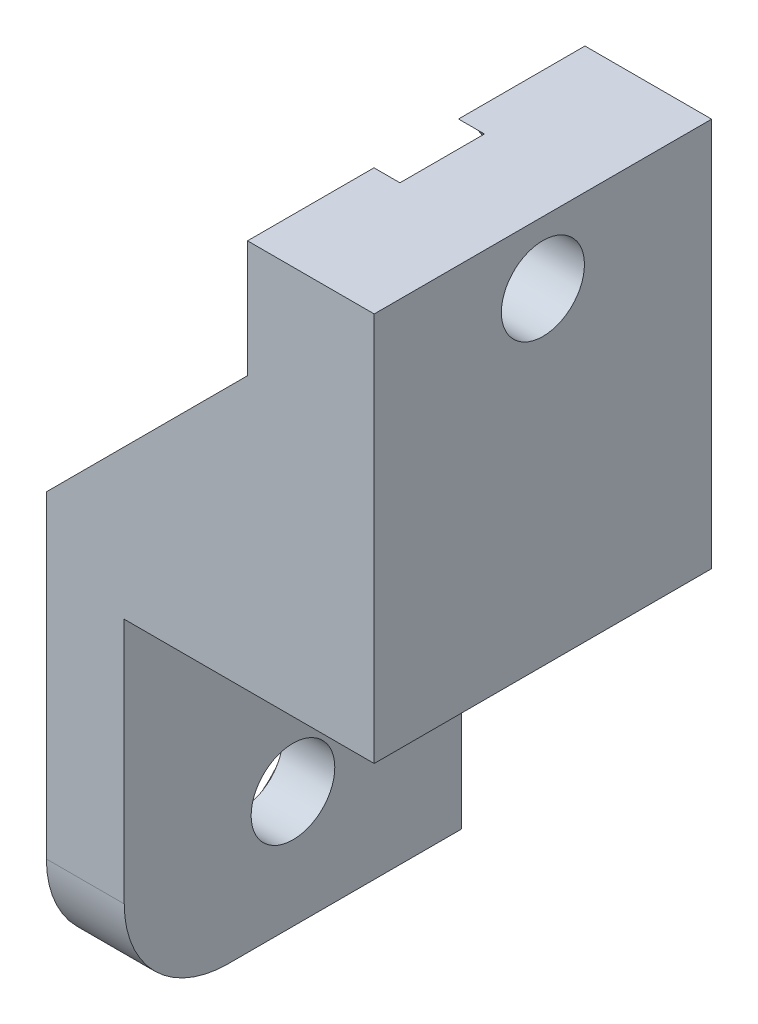
ISO-10303-21;
HEADER;
FILE_DESCRIPTION(('STEP AP214'),'2;1');
FILE_NAME('part.step','',(''),(''),'','','');
FILE_SCHEMA(('AUTOMOTIVE_DESIGN { 1 0 10303 214 1 1 1 1 }'));
ENDSEC;
DATA;
#1=APPLICATION_CONTEXT('core data for automotive mechanical design processes');
#2=APPLICATION_PROTOCOL_DEFINITION('international standard','automotive_design',2000,#1);
#3=PRODUCT_CONTEXT('',#1,'mechanical');
#4=PRODUCT('Part','Part','',(#3));
#5=PRODUCT_RELATED_PRODUCT_CATEGORY('part','',(#4));
#6=PRODUCT_DEFINITION_FORMATION('','',#4);
#7=PRODUCT_DEFINITION_CONTEXT('part definition',#1,'design');
#8=PRODUCT_DEFINITION('design','',#6,#7);
#9=PRODUCT_DEFINITION_SHAPE('','',#8);
#10=(LENGTH_UNIT() NAMED_UNIT(*) SI_UNIT(.MILLI.,.METRE.));
#11=(NAMED_UNIT(*) PLANE_ANGLE_UNIT() SI_UNIT($,.RADIAN.));
#12=(NAMED_UNIT(*) SI_UNIT($,.STERADIAN.) SOLID_ANGLE_UNIT());
#13=UNCERTAINTY_MEASURE_WITH_UNIT(LENGTH_MEASURE(1.E-05),#10,'distance_accuracy_value','');
#14=(GEOMETRIC_REPRESENTATION_CONTEXT(3) GLOBAL_UNCERTAINTY_ASSIGNED_CONTEXT((#13)) GLOBAL_UNIT_ASSIGNED_CONTEXT((#10,
#11,#12)) REPRESENTATION_CONTEXT('',''));
#15=CARTESIAN_POINT('',(0.,0.,0.));
#16=DIRECTION('',(0.,0.,1.));
#17=DIRECTION('',(1.,0.,0.));
#18=AXIS2_PLACEMENT_3D('',#15,#16,#17);
#19=CARTESIAN_POINT('',(30.3343708985291,78.2634604627299,85.1716360974316));
#20=DIRECTION('',(-1.,0.,0.));
#21=DIRECTION('',(0.,0.,1.));
#22=AXIS2_PLACEMENT_3D('',#19,#20,#21);
#23=PLANE('',#22);
#24=DIRECTION('',(0.,-1.,0.));
#25=VECTOR('',#24,1.);
#26=CARTESIAN_POINT('',(30.3343708985291,78.2634604627299,85.1716360974316));
#27=LINE('',#26,#25);
#28=CARTESIAN_POINT('',(30.3343708985291,78.2634604627299,85.1716360974316));
#29=VERTEX_POINT('',#28);
#30=CARTESIAN_POINT('',(30.3343708985291,73.76346046273,85.1716360974316));
#31=VERTEX_POINT('',#30);
#32=EDGE_CURVE('E258',#29,#31,#27,.T.);
#33=ORIENTED_EDGE('',*,*,#32,.T.);
#34=DIRECTION('',(0.,0.,1.));
#35=VECTOR('',#34,1.);
#36=CARTESIAN_POINT('',(30.3343708985291,73.76346046273,98.1716360974316));
#37=LINE('',#36,#35);
#38=CARTESIAN_POINT('',(30.3343708985291,73.76346046273,89.6716360974314));
#39=VERTEX_POINT('',#38);
#40=EDGE_CURVE('E211',#31,#39,#37,.T.);
#41=ORIENTED_EDGE('',*,*,#40,.T.);
#42=CARTESIAN_POINT('',(30.3343708985291,75.8634604627299,91.6716360974316));
#43=DIRECTION('',(-1.,0.,0.));
#44=DIRECTION('',(0.,0.,1.));
#45=AXIS2_PLACEMENT_3D('',#42,#43,#44);
#46=CIRCLE('',#45,2.9);
#47=CARTESIAN_POINT('',(30.3343708985291,78.2634604627299,90.0437540378216));
#48=VERTEX_POINT('',#47);
#49=EDGE_CURVE('E146',#48,#39,#46,.T.);
#50=ORIENTED_EDGE('',*,*,#49,.F.);
#51=DIRECTION('',(0.,0.,1.));
#52=VECTOR('',#51,1.);
#53=CARTESIAN_POINT('',(30.3343708985291,78.2634604627299,85.1716360974316));
#54=LINE('',#53,#52);
#55=EDGE_CURVE('E157',#29,#48,#54,.T.);
#56=ORIENTED_EDGE('',*,*,#55,.F.);
#57=EDGE_LOOP('',(#33,#41,#50,#56));
#58=FACE_BOUND('',#57,.T.);
#59=ADVANCED_FACE('F45',(#58),#23,.T.);
#60=CARTESIAN_POINT('',(45.2143708985291,75.8634604627299,91.6716360974316));
#61=DIRECTION('',(-1.,0.,0.));
#62=DIRECTION('',(0.,0.,1.));
#63=AXIS2_PLACEMENT_3D('',#60,#61,#62);
#64=CYLINDRICAL_SURFACE('',#63,1.60000000000001);
#65=CARTESIAN_POINT('',(35.2143708985291,75.8634604627299,91.6716360974316));
#66=DIRECTION('',(1.,0.,0.));
#67=DIRECTION('',(0.,0.,-1.));
#68=AXIS2_PLACEMENT_3D('',#65,#66,#67);
#69=CIRCLE('',#68,1.60000000000001);
#70=CARTESIAN_POINT('',(35.2143708985291,75.8634604627299,90.0716360974316));
#71=VERTEX_POINT('',#70);
#72=EDGE_CURVE('E191',#71,#71,#69,.F.);
#73=ORIENTED_EDGE('',*,*,#72,.F.);
#74=EDGE_LOOP('',(#73));
#75=FACE_BOUND('',#74,.T.);
#76=CARTESIAN_POINT('',(31.3343708985291,75.8634604627299,91.6716360974316));
#77=DIRECTION('',(-1.,0.,0.));
#78=DIRECTION('',(0.,0.,1.));
#79=AXIS2_PLACEMENT_3D('',#76,#77,#78);
#80=CIRCLE('',#79,1.60000000000001);
#81=CARTESIAN_POINT('',(31.3343708985291,75.8634604627299,93.2716360974316));
#82=VERTEX_POINT('',#81);
#83=EDGE_CURVE('E201',#82,#82,#80,.T.);
#84=ORIENTED_EDGE('',*,*,#83,.T.);
#85=EDGE_LOOP('',(#84));
#86=FACE_BOUND('',#85,.T.);
#87=ADVANCED_FACE('F332',(#75,#86),#64,.F.);
#88=CARTESIAN_POINT('',(45.2143708985291,54.2634604627299,91.6716360974316));
#89=DIRECTION('',(-1.,0.,0.));
#90=DIRECTION('',(0.,0.,1.));
#91=AXIS2_PLACEMENT_3D('',#88,#89,#90);
#92=CYLINDRICAL_SURFACE('',#91,1.61153758521372);
#93=CARTESIAN_POINT('',(25.5843708985291,54.2634604627299,91.6716360974316));
#94=DIRECTION('',(1.,0.,0.));
#95=DIRECTION('',(0.,0.,-1.));
#96=AXIS2_PLACEMENT_3D('',#93,#94,#95);
#97=CIRCLE('',#96,1.61153758521372);
#98=CARTESIAN_POINT('',(25.5843708985291,54.2634604627299,90.0600985122179));
#99=VERTEX_POINT('',#98);
#100=EDGE_CURVE('E195',#99,#99,#97,.F.);
#101=ORIENTED_EDGE('',*,*,#100,.F.);
#102=EDGE_LOOP('',(#101));
#103=FACE_BOUND('',#102,.T.);
#104=CARTESIAN_POINT('',(23.5843708985291,54.2634604627299,91.6716360974316));
#105=DIRECTION('',(-1.,0.,0.));
#106=DIRECTION('',(0.,0.,1.));
#107=AXIS2_PLACEMENT_3D('',#104,#105,#106);
#108=CIRCLE('',#107,1.61153758521372);
#109=CARTESIAN_POINT('',(23.5843708985291,54.2634604627299,93.2831736826453));
#110=VERTEX_POINT('',#109);
#111=EDGE_CURVE('E196',#110,#110,#108,.T.);
#112=ORIENTED_EDGE('',*,*,#111,.T.);
#113=EDGE_LOOP('',(#112));
#114=FACE_BOUND('',#113,.T.);
#115=ADVANCED_FACE('F337',(#103,#114),#92,.F.);
#116=CARTESIAN_POINT('',(30.3343708985291,73.76346046273,93.6716360974317));
#117=VERTEX_POINT('',#116);
#118=CARTESIAN_POINT('',(30.3343708985291,78.2634604627299,93.2995181570416));
#119=VERTEX_POINT('',#118);
#120=EDGE_CURVE('E134',#117,#119,#46,.T.);
#121=ORIENTED_EDGE('',*,*,#120,.F.);
#122=DIRECTION('',(0.,0.,1.));
#123=VECTOR('',#122,1.);
#124=CARTESIAN_POINT('',(30.3343708985291,73.76346046273,98.1716360974316));
#125=LINE('',#124,#123);
#126=CARTESIAN_POINT('',(30.3343708985291,73.76346046273,98.1716360974316));
#127=VERTEX_POINT('',#126);
#128=EDGE_CURVE('E208',#117,#127,#125,.T.);
#129=ORIENTED_EDGE('',*,*,#128,.T.);
#130=DIRECTION('',(0.,-1.,0.));
#131=VECTOR('',#130,1.);
#132=CARTESIAN_POINT('',(30.3343708985291,78.2634604627299,98.1716360974316));
#133=LINE('',#132,#131);
#134=CARTESIAN_POINT('',(30.3343708985291,78.2634604627299,98.1716360974316));
#135=VERTEX_POINT('',#134);
#136=EDGE_CURVE('E161',#135,#127,#133,.T.);
#137=ORIENTED_EDGE('',*,*,#136,.F.);
#138=EDGE_CURVE('E152',#119,#135,#54,.T.);
#139=ORIENTED_EDGE('',*,*,#138,.F.);
#140=EDGE_LOOP('',(#121,#129,#137,#139));
#141=FACE_BOUND('',#140,.T.);
#142=ADVANCED_FACE('F159',(#141),#23,.T.);
#143=CARTESIAN_POINT('',(30.3343708985291,78.2634604627299,85.1716360974316));
#144=DIRECTION('',(0.,1.,0.));
#145=DIRECTION('',(0.,0.,1.));
#146=AXIS2_PLACEMENT_3D('',#143,#144,#145);
#147=PLANE('',#146);
#148=DIRECTION('',(-1.,0.,0.));
#149=VECTOR('',#148,1.);
#150=CARTESIAN_POINT('',(31.3343708985291,78.2634604627299,90.0437540378216));
#151=LINE('',#150,#149);
#152=CARTESIAN_POINT('',(31.3343708985291,78.2634604627299,90.0437540378216));
#153=VERTEX_POINT('',#152);
#154=EDGE_CURVE('E156',#153,#48,#151,.T.);
#155=ORIENTED_EDGE('',*,*,#154,.F.);
#156=DIRECTION('',(0.,0.,1.));
#157=VECTOR('',#156,1.);
#158=CARTESIAN_POINT('',(31.3343708985291,78.2634604627299,85.1716360974316));
#159=LINE('',#158,#157);
#160=CARTESIAN_POINT('',(31.3343708985291,78.2634604627299,93.2995181570416));
#161=VERTEX_POINT('',#160);
#162=EDGE_CURVE('E154',#153,#161,#159,.T.);
#163=ORIENTED_EDGE('',*,*,#162,.T.);
#164=DIRECTION('',(-1.,0.,0.));
#165=VECTOR('',#164,1.);
#166=CARTESIAN_POINT('',(31.3343708985291,78.2634604627299,93.2995181570416));
#167=LINE('',#166,#165);
#168=EDGE_CURVE('E138',#119,#161,#167,.F.);
#169=ORIENTED_EDGE('',*,*,#168,.F.);
#170=ORIENTED_EDGE('',*,*,#138,.T.);
#171=DIRECTION('',(-1.,0.,0.));
#172=VECTOR('',#171,1.);
#173=CARTESIAN_POINT('',(30.3343708985291,78.2634604627299,98.1716360974316));
#174=LINE('',#173,#172);
#175=CARTESIAN_POINT('',(35.2143708985291,78.2634604627299,98.1716360974316));
#176=VERTEX_POINT('',#175);
#177=EDGE_CURVE('E174',#176,#135,#174,.T.);
#178=ORIENTED_EDGE('',*,*,#177,.F.);
#179=DIRECTION('',(0.,0.,1.));
#180=VECTOR('',#179,1.);
#181=CARTESIAN_POINT('',(35.2143708985291,78.2634604627299,85.1716360974316));
#182=LINE('',#181,#180);
#183=CARTESIAN_POINT('',(35.2143708985291,78.2634604627299,85.1716360974316));
#184=VERTEX_POINT('',#183);
#185=EDGE_CURVE('E164',#184,#176,#182,.T.);
#186=ORIENTED_EDGE('',*,*,#185,.F.);
#187=DIRECTION('',(-1.,0.,0.));
#188=VECTOR('',#187,1.);
#189=CARTESIAN_POINT('',(30.3343708985291,78.2634604627299,85.1716360974316));
#190=LINE('',#189,#188);
#191=EDGE_CURVE('E190',#184,#29,#190,.T.);
#192=ORIENTED_EDGE('',*,*,#191,.T.);
#193=ORIENTED_EDGE('',*,*,#55,.T.);
#194=EDGE_LOOP('',(#155,#163,#169,#170,#178,#186,#192,#193));
#195=FACE_BOUND('',#194,.T.);
#196=ADVANCED_FACE('F150',(#195),#147,.T.);
#197=CARTESIAN_POINT('',(35.2143708985291,78.2634604627299,85.1716360974316));
#198=DIRECTION('',(1.,0.,0.));
#199=DIRECTION('',(0.,0.,-1.));
#200=AXIS2_PLACEMENT_3D('',#197,#198,#199);
#201=PLANE('',#200);
#202=ORIENTED_EDGE('',*,*,#72,.T.);
#203=EDGE_LOOP('',(#202));
#204=FACE_BOUND('',#203,.T.);
#205=DIRECTION('',(0.,1.,0.));
#206=VECTOR('',#205,1.);
#207=CARTESIAN_POINT('',(35.2143708985291,78.2634604627299,98.1716360974316));
#208=LINE('',#207,#206);
#209=CARTESIAN_POINT('',(35.2143708985291,63.2634604627299,98.1716360974316));
#210=VERTEX_POINT('',#209);
#211=EDGE_CURVE('E260',#210,#176,#208,.T.);
#212=ORIENTED_EDGE('',*,*,#211,.F.);
#213=DIRECTION('',(0.,0.,1.));
#214=VECTOR('',#213,1.);
#215=CARTESIAN_POINT('',(35.2143708985291,63.2634604627299,85.1716360974316));
#216=LINE('',#215,#214);
#217=CARTESIAN_POINT('',(35.2143708985291,63.2634604627299,85.1716360974316));
#218=VERTEX_POINT('',#217);
#219=EDGE_CURVE('E171',#218,#210,#216,.T.);
#220=ORIENTED_EDGE('',*,*,#219,.F.);
#221=DIRECTION('',(0.,1.,0.));
#222=VECTOR('',#221,1.);
#223=CARTESIAN_POINT('',(35.2143708985291,63.2634604627299,85.1716360974316));
#224=LINE('',#223,#222);
#225=EDGE_CURVE('E244',#218,#184,#224,.T.);
#226=ORIENTED_EDGE('',*,*,#225,.T.);
#227=ORIENTED_EDGE('',*,*,#185,.T.);
#228=EDGE_LOOP('',(#212,#220,#226,#227));
#229=FACE_BOUND('',#228,.T.);
#230=ADVANCED_FACE('F321',(#204,#229),#201,.T.);
#231=CARTESIAN_POINT('',(25.5843708985291,63.2634604627299,85.1716360974316));
#232=DIRECTION('',(0.,-1.,0.));
#233=DIRECTION('',(1.,0.,0.));
#234=AXIS2_PLACEMENT_3D('',#231,#232,#233);
#235=PLANE('',#234);
#236=DIRECTION('',(1.,0.,0.));
#237=VECTOR('',#236,1.);
#238=CARTESIAN_POINT('',(25.5843708985291,63.2634604627299,98.1716360974316));
#239=LINE('',#238,#237);
#240=CARTESIAN_POINT('',(25.5843708985291,63.2634604627299,98.1716360974316));
#241=VERTEX_POINT('',#240);
#242=EDGE_CURVE('E266',#241,#210,#239,.T.);
#243=ORIENTED_EDGE('',*,*,#242,.F.);
#244=DIRECTION('',(0.,0.,1.));
#245=VECTOR('',#244,1.);
#246=CARTESIAN_POINT('',(25.5843708985291,63.2634604627299,85.1716360974316));
#247=LINE('',#246,#245);
#248=CARTESIAN_POINT('',(25.5843708985291,63.2634604627299,85.1716360974316));
#249=VERTEX_POINT('',#248);
#250=EDGE_CURVE('E180',#249,#241,#247,.T.);
#251=ORIENTED_EDGE('',*,*,#250,.F.);
#252=DIRECTION('',(1.,0.,0.));
#253=VECTOR('',#252,1.);
#254=CARTESIAN_POINT('',(25.5843708985291,63.2634604627299,85.1716360974316));
#255=LINE('',#254,#253);
#256=EDGE_CURVE('E245',#249,#218,#255,.T.);
#257=ORIENTED_EDGE('',*,*,#256,.T.);
#258=ORIENTED_EDGE('',*,*,#219,.T.);
#259=EDGE_LOOP('',(#243,#251,#257,#258));
#260=FACE_BOUND('',#259,.T.);
#261=ADVANCED_FACE('F319',(#260),#235,.T.);
#262=CARTESIAN_POINT('',(25.5843708985291,49.7634604627299,85.1716360974316));
#263=DIRECTION('',(1.,0.,0.));
#264=DIRECTION('',(0.,0.,-1.));
#265=AXIS2_PLACEMENT_3D('',#262,#263,#264);
#266=PLANE('',#265);
#267=ORIENTED_EDGE('',*,*,#100,.T.);
#268=EDGE_LOOP('',(#267));
#269=FACE_BOUND('',#268,.T.);
#270=DIRECTION('',(0.,1.,0.));
#271=VECTOR('',#270,1.);
#272=CARTESIAN_POINT('',(25.5843708985291,49.7634604627299,98.1716360974316));
#273=LINE('',#272,#271);
#274=CARTESIAN_POINT('',(25.5843708985291,53.7634604627299,98.1716360974316));
#275=VERTEX_POINT('',#274);
#276=EDGE_CURVE('E269',#275,#241,#273,.T.);
#277=ORIENTED_EDGE('',*,*,#276,.F.);
#278=CARTESIAN_POINT('',(25.5843708985291,53.7634604627299,94.1716360974316));
#279=DIRECTION('',(1.,0.,0.));
#280=DIRECTION('',(0.,0.,-1.));
#281=AXIS2_PLACEMENT_3D('',#278,#279,#280);
#282=CIRCLE('',#281,4.);
#283=CARTESIAN_POINT('',(25.5843708985291,49.7634604627299,94.1716360974316));
#284=VERTEX_POINT('',#283);
#285=EDGE_CURVE('E68',#275,#284,#282,.T.);
#286=ORIENTED_EDGE('',*,*,#285,.T.);
#287=DIRECTION('',(0.,0.,1.));
#288=VECTOR('',#287,1.);
#289=CARTESIAN_POINT('',(25.5843708985291,49.7634604627299,85.1716360974316));
#290=LINE('',#289,#288);
#291=CARTESIAN_POINT('',(25.5843708985291,49.7634604627299,85.1716360974316));
#292=VERTEX_POINT('',#291);
#293=EDGE_CURVE('E184',#292,#284,#290,.T.);
#294=ORIENTED_EDGE('',*,*,#293,.F.);
#295=DIRECTION('',(0.,1.,0.));
#296=VECTOR('',#295,1.);
#297=CARTESIAN_POINT('',(25.5843708985291,49.7634604627299,85.1716360974316));
#298=LINE('',#297,#296);
#299=EDGE_CURVE('E241',#292,#249,#298,.T.);
#300=ORIENTED_EDGE('',*,*,#299,.T.);
#301=ORIENTED_EDGE('',*,*,#250,.T.);
#302=EDGE_LOOP('',(#277,#286,#294,#300,#301));
#303=FACE_BOUND('',#302,.T.);
#304=ADVANCED_FACE('F316',(#269,#303),#266,.T.);
#305=CARTESIAN_POINT('',(22.5843708985291,49.7634604627299,85.1716360974316));
#306=DIRECTION('',(0.,-1.,0.));
#307=DIRECTION('',(0.,0.,-1.));
#308=AXIS2_PLACEMENT_3D('',#305,#306,#307);
#309=PLANE('',#308);
#310=ORIENTED_EDGE('',*,*,#293,.T.);
#311=DIRECTION('',(1.,0.,0.));
#312=VECTOR('',#311,1.);
#313=CARTESIAN_POINT('',(22.5843708985291,49.7634604627299,94.1716360974316));
#314=LINE('',#313,#312);
#315=CARTESIAN_POINT('',(22.5843708985291,49.7634604627299,94.1716360974316));
#316=VERTEX_POINT('',#315);
#317=EDGE_CURVE('E54',#284,#316,#314,.F.);
#318=ORIENTED_EDGE('',*,*,#317,.T.);
#319=DIRECTION('',(0.,0.,1.));
#320=VECTOR('',#319,1.);
#321=CARTESIAN_POINT('',(22.5843708985291,49.7634604627299,85.1716360974316));
#322=LINE('',#321,#320);
#323=CARTESIAN_POINT('',(22.5843708985291,49.7634604627299,85.1716360974316));
#324=VERTEX_POINT('',#323);
#325=EDGE_CURVE('E187',#324,#316,#322,.T.);
#326=ORIENTED_EDGE('',*,*,#325,.F.);
#327=DIRECTION('',(1.,0.,0.));
#328=VECTOR('',#327,1.);
#329=CARTESIAN_POINT('',(22.5843708985291,49.7634604627299,85.1716360974316));
#330=LINE('',#329,#328);
#331=EDGE_CURVE('E238',#324,#292,#330,.T.);
#332=ORIENTED_EDGE('',*,*,#331,.T.);
#333=EDGE_LOOP('',(#310,#318,#326,#332));
#334=FACE_BOUND('',#333,.T.);
#335=ADVANCED_FACE('F313',(#334),#309,.T.);
#336=CARTESIAN_POINT('',(22.5843708985291,49.7634604627299,85.1716360974316));
#337=DIRECTION('',(-1.,0.,0.));
#338=DIRECTION('',(0.,0.,1.));
#339=AXIS2_PLACEMENT_3D('',#336,#337,#338);
#340=PLANE('',#339);
#341=CARTESIAN_POINT('',(22.5843708985291,54.2634604627299,91.6716360974316));
#342=DIRECTION('',(-1.,0.,0.));
#343=DIRECTION('',(0.,0.,1.));
#344=AXIS2_PLACEMENT_3D('',#341,#342,#343);
#345=CIRCLE('',#344,3.00000000000001);
#346=CARTESIAN_POINT('',(22.5843708985291,54.2634604627299,94.6716360974316));
#347=VERTEX_POINT('',#346);
#348=EDGE_CURVE('E249',#347,#347,#345,.T.);
#349=ORIENTED_EDGE('',*,*,#348,.F.);
#350=EDGE_LOOP('',(#349));
#351=FACE_BOUND('',#350,.T.);
#352=ORIENTED_EDGE('',*,*,#325,.T.);
#353=CARTESIAN_POINT('',(22.5843708985291,53.7634604627299,94.1716360974316));
#354=DIRECTION('',(-1.,0.,0.));
#355=DIRECTION('',(0.,0.,1.));
#356=AXIS2_PLACEMENT_3D('',#353,#354,#355);
#357=CIRCLE('',#356,4.);
#358=CARTESIAN_POINT('',(22.5843708985291,53.7634604627299,98.1716360974316));
#359=VERTEX_POINT('',#358);
#360=EDGE_CURVE('E11',#316,#359,#357,.T.);
#361=ORIENTED_EDGE('',*,*,#360,.T.);
#362=DIRECTION('',(0.,-1.,0.));
#363=VECTOR('',#362,1.);
#364=CARTESIAN_POINT('',(22.5843708985291,49.7634604627299,98.1716360974316));
#365=LINE('',#364,#363);
#366=CARTESIAN_POINT('',(22.5843708985291,66.01346046273,98.1716360974316));
#367=VERTEX_POINT('',#366);
#368=EDGE_CURVE('E235',#367,#359,#365,.T.);
#369=ORIENTED_EDGE('',*,*,#368,.F.);
#370=DIRECTION('',(0.,0.,1.));
#371=VECTOR('',#370,1.);
#372=CARTESIAN_POINT('',(22.5843708985291,66.01346046273,85.1716360974316));
#373=LINE('',#372,#371);
#374=CARTESIAN_POINT('',(22.5843708985291,66.01346046273,85.1716360974316));
#375=VERTEX_POINT('',#374);
#376=EDGE_CURVE('E221',#367,#375,#373,.F.);
#377=ORIENTED_EDGE('',*,*,#376,.T.);
#378=DIRECTION('',(0.,-1.,0.));
#379=VECTOR('',#378,1.);
#380=CARTESIAN_POINT('',(22.5843708985291,63.7634604627299,85.1716360974316));
#381=LINE('',#380,#379);
#382=EDGE_CURVE('E242',#375,#324,#381,.T.);
#383=ORIENTED_EDGE('',*,*,#382,.T.);
#384=EDGE_LOOP('',(#352,#361,#369,#377,#383));
#385=FACE_BOUND('',#384,.T.);
#386=ADVANCED_FACE('F312',(#351,#385),#340,.T.);
#387=CARTESIAN_POINT('',(0.,0.,85.1716360974316));
#388=DIRECTION('',(0.,0.,-1.));
#389=DIRECTION('',(-1.,0.,0.));
#390=AXIS2_PLACEMENT_3D('',#387,#388,#389);
#391=PLANE('',#390);
#392=ORIENTED_EDGE('',*,*,#32,.F.);
#393=ORIENTED_EDGE('',*,*,#191,.F.);
#394=ORIENTED_EDGE('',*,*,#225,.F.);
#395=ORIENTED_EDGE('',*,*,#256,.F.);
#396=ORIENTED_EDGE('',*,*,#299,.F.);
#397=ORIENTED_EDGE('',*,*,#331,.F.);
#398=ORIENTED_EDGE('',*,*,#382,.F.);
#399=DIRECTION('',(-0.707106781186545,-0.70710678118655,0.));
#400=VECTOR('',#399,1.);
#401=CARTESIAN_POINT('',(30.3343708985291,73.76346046273,85.1716360974316));
#402=LINE('',#401,#400);
#403=EDGE_CURVE('E225',#375,#31,#402,.F.);
#404=ORIENTED_EDGE('',*,*,#403,.T.);
#405=EDGE_LOOP('',(#392,#393,#394,#395,#396,#397,#398,#404));
#406=FACE_BOUND('',#405,.T.);
#407=ADVANCED_FACE('F299',(#406),#391,.T.);
#408=CARTESIAN_POINT('',(0.,0.,98.1716360974316));
#409=DIRECTION('',(0.,0.,-1.));
#410=DIRECTION('',(-1.,0.,0.));
#411=AXIS2_PLACEMENT_3D('',#408,#409,#410);
#412=PLANE('',#411);
#413=ORIENTED_EDGE('',*,*,#368,.T.);
#414=DIRECTION('',(1.,0.,0.));
#415=VECTOR('',#414,1.);
#416=CARTESIAN_POINT('',(25.5843708985291,53.7634604627299,98.1716360974316));
#417=LINE('',#416,#415);
#418=EDGE_CURVE('E228',#359,#275,#417,.T.);
#419=ORIENTED_EDGE('',*,*,#418,.T.);
#420=ORIENTED_EDGE('',*,*,#276,.T.);
#421=ORIENTED_EDGE('',*,*,#242,.T.);
#422=ORIENTED_EDGE('',*,*,#211,.T.);
#423=ORIENTED_EDGE('',*,*,#177,.T.);
#424=ORIENTED_EDGE('',*,*,#136,.T.);
#425=DIRECTION('',(0.707106781186545,0.70710678118655,0.));
#426=VECTOR('',#425,1.);
#427=CARTESIAN_POINT('',(-21.7145447821004,21.7145447821002,98.1716360974316));
#428=LINE('',#427,#426);
#429=EDGE_CURVE('E217',#127,#367,#428,.F.);
#430=ORIENTED_EDGE('',*,*,#429,.T.);
#431=EDGE_LOOP('',(#413,#419,#420,#421,#422,#423,#424,#430));
#432=FACE_BOUND('',#431,.T.);
#433=ADVANCED_FACE('F307',(#432),#412,.F.);
#434=CARTESIAN_POINT('',(23.5843708985291,54.2634604627299,91.6716360974316));
#435=DIRECTION('',(-1.,0.,0.));
#436=DIRECTION('',(0.,0.,1.));
#437=AXIS2_PLACEMENT_3D('',#434,#435,#436);
#438=CYLINDRICAL_SURFACE('',#437,3.00000000000001);
#439=CARTESIAN_POINT('',(23.5843708985291,54.2634604627299,91.6716360974316));
#440=DIRECTION('',(-1.,0.,0.));
#441=DIRECTION('',(0.,0.,1.));
#442=AXIS2_PLACEMENT_3D('',#439,#440,#441);
#443=CIRCLE('',#442,3.00000000000001);
#444=CARTESIAN_POINT('',(23.5843708985291,54.2634604627299,94.6716360974316));
#445=VERTEX_POINT('',#444);
#446=EDGE_CURVE('E200',#445,#445,#443,.T.);
#447=ORIENTED_EDGE('',*,*,#446,.F.);
#448=EDGE_LOOP('',(#447));
#449=FACE_BOUND('',#448,.T.);
#450=ORIENTED_EDGE('',*,*,#348,.T.);
#451=EDGE_LOOP('',(#450));
#452=FACE_BOUND('',#451,.T.);
#453=ADVANCED_FACE('F356',(#449,#452),#438,.F.);
#454=CARTESIAN_POINT('',(23.5843708985291,54.2634604627299,91.6716360974316));
#455=DIRECTION('',(-1.,0.,0.));
#456=DIRECTION('',(0.,0.,1.));
#457=AXIS2_PLACEMENT_3D('',#454,#455,#456);
#458=PLANE('',#457);
#459=ORIENTED_EDGE('',*,*,#111,.F.);
#460=EDGE_LOOP('',(#459));
#461=FACE_BOUND('',#460,.T.);
#462=ORIENTED_EDGE('',*,*,#446,.T.);
#463=EDGE_LOOP('',(#462));
#464=FACE_BOUND('',#463,.T.);
#465=ADVANCED_FACE('F360',(#461,#464),#458,.T.);
#466=CARTESIAN_POINT('',(31.3343708985291,75.8634604627299,91.6716360974316));
#467=DIRECTION('',(-1.,0.,0.));
#468=DIRECTION('',(0.,0.,1.));
#469=AXIS2_PLACEMENT_3D('',#466,#467,#468);
#470=CYLINDRICAL_SURFACE('',#469,2.9);
#471=ORIENTED_EDGE('',*,*,#154,.T.);
#472=ORIENTED_EDGE('',*,*,#49,.T.);
#473=CARTESIAN_POINT('',(32.4343708985289,75.8634604627299,91.6716360974316));
#474=DIRECTION('',(-0.70710678118655,0.707106781186545,0.));
#475=DIRECTION('',(-0.707106781186545,-0.70710678118655,0.));
#476=AXIS2_PLACEMENT_3D('',#473,#474,#475);
#477=ELLIPSE('',#476,4.10121933088196,2.9);
#478=EDGE_CURVE('E141',#39,#117,#477,.T.);
#479=ORIENTED_EDGE('',*,*,#478,.T.);
#480=ORIENTED_EDGE('',*,*,#120,.T.);
#481=ORIENTED_EDGE('',*,*,#168,.T.);
#482=CARTESIAN_POINT('',(31.3343708985291,75.8634604627299,91.6716360974316));
#483=DIRECTION('',(-1.,0.,0.));
#484=DIRECTION('',(0.,0.,1.));
#485=AXIS2_PLACEMENT_3D('',#482,#483,#484);
#486=CIRCLE('',#485,2.9);
#487=EDGE_CURVE('E204',#153,#161,#486,.T.);
#488=ORIENTED_EDGE('',*,*,#487,.F.);
#489=EDGE_LOOP('',(#471,#472,#479,#480,#481,#488));
#490=FACE_BOUND('',#489,.T.);
#491=ADVANCED_FACE('F136',(#490),#470,.F.);
#492=CARTESIAN_POINT('',(31.3343708985291,75.8634604627299,91.6716360974316));
#493=DIRECTION('',(-1.,0.,0.));
#494=DIRECTION('',(0.,0.,1.));
#495=AXIS2_PLACEMENT_3D('',#492,#493,#494);
#496=PLANE('',#495);
#497=ORIENTED_EDGE('',*,*,#83,.F.);
#498=EDGE_LOOP('',(#497));
#499=FACE_BOUND('',#498,.T.);
#500=ORIENTED_EDGE('',*,*,#487,.T.);
#501=ORIENTED_EDGE('',*,*,#162,.F.);
#502=EDGE_LOOP('',(#500,#501));
#503=FACE_BOUND('',#502,.T.);
#504=ADVANCED_FACE('F291',(#499,#503),#496,.T.);
#505=CARTESIAN_POINT('',(30.3343708985291,73.76346046273,85.1716360974316));
#506=DIRECTION('',(-0.70710678118655,0.707106781186545,0.));
#507=DIRECTION('',(0.,0.,-1.));
#508=AXIS2_PLACEMENT_3D('',#505,#506,#507);
#509=PLANE('',#508);
#510=ORIENTED_EDGE('',*,*,#403,.F.);
#511=ORIENTED_EDGE('',*,*,#376,.F.);
#512=ORIENTED_EDGE('',*,*,#429,.F.);
#513=ORIENTED_EDGE('',*,*,#128,.F.);
#514=ORIENTED_EDGE('',*,*,#478,.F.);
#515=ORIENTED_EDGE('',*,*,#40,.F.);
#516=EDGE_LOOP('',(#510,#511,#512,#513,#514,#515));
#517=FACE_BOUND('',#516,.T.);
#518=ADVANCED_FACE('F305',(#517),#509,.T.);
#519=CARTESIAN_POINT('',(0.,53.7634604627299,94.1716360974316));
#520=DIRECTION('',(-1.,0.,0.));
#521=DIRECTION('',(0.,0.,1.));
#522=AXIS2_PLACEMENT_3D('',#519,#520,#521);
#523=CYLINDRICAL_SURFACE('',#522,4.);
#524=ORIENTED_EDGE('',*,*,#360,.F.);
#525=ORIENTED_EDGE('',*,*,#317,.F.);
#526=ORIENTED_EDGE('',*,*,#285,.F.);
#527=ORIENTED_EDGE('',*,*,#418,.F.);
#528=EDGE_LOOP('',(#524,#525,#526,#527));
#529=FACE_BOUND('',#528,.T.);
#530=ADVANCED_FACE('F47',(#529),#523,.T.);
#531=CLOSED_SHELL('',(#59,#87,#115,#142,#196,#230,#261,#304,#335,#386,#407,#433,#453,#465,#491,
#504,#518,#530));
#532=MANIFOLD_SOLID_BREP('B2',#531);
#533=ADVANCED_BREP_SHAPE_REPRESENTATION('',(#18,#532),#14);
#534=SHAPE_DEFINITION_REPRESENTATION(#9,#533);
ENDSEC;
END-ISO-10303-21;
